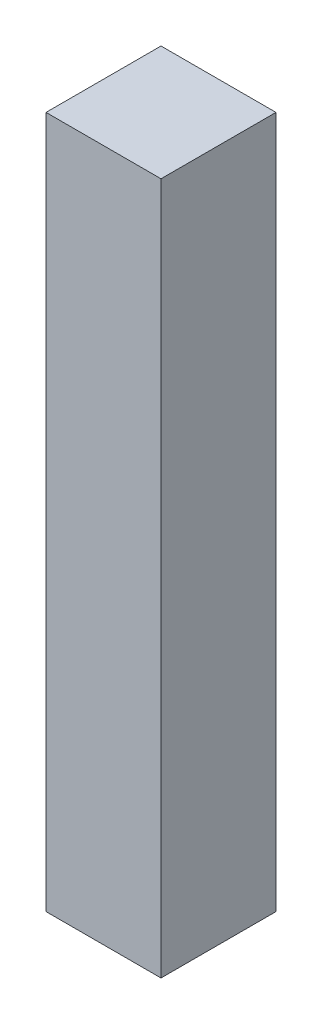
ISO-10303-21;
HEADER;
FILE_DESCRIPTION(('STEP AP214'),'2;1');
FILE_NAME('part.step','',(''),(''),'','','');
FILE_SCHEMA(('AUTOMOTIVE_DESIGN { 1 0 10303 214 1 1 1 1 }'));
ENDSEC;
DATA;
#1=APPLICATION_CONTEXT('core data for automotive mechanical design processes');
#2=APPLICATION_PROTOCOL_DEFINITION('international standard','automotive_design',2000,#1);
#3=PRODUCT_CONTEXT('',#1,'mechanical');
#4=PRODUCT('Part','Part','',(#3));
#5=PRODUCT_RELATED_PRODUCT_CATEGORY('part','',(#4));
#6=PRODUCT_DEFINITION_FORMATION('','',#4);
#7=PRODUCT_DEFINITION_CONTEXT('part definition',#1,'design');
#8=PRODUCT_DEFINITION('design','',#6,#7);
#9=PRODUCT_DEFINITION_SHAPE('','',#8);
#10=(LENGTH_UNIT() NAMED_UNIT(*) SI_UNIT(.MILLI.,.METRE.));
#11=(NAMED_UNIT(*) PLANE_ANGLE_UNIT() SI_UNIT($,.RADIAN.));
#12=(NAMED_UNIT(*) SI_UNIT($,.STERADIAN.) SOLID_ANGLE_UNIT());
#13=UNCERTAINTY_MEASURE_WITH_UNIT(LENGTH_MEASURE(1.E-05),#10,'distance_accuracy_value','');
#14=(GEOMETRIC_REPRESENTATION_CONTEXT(3) GLOBAL_UNCERTAINTY_ASSIGNED_CONTEXT((#13)) GLOBAL_UNIT_ASSIGNED_CONTEXT((#10,
#11,#12)) REPRESENTATION_CONTEXT('',''));
#15=CARTESIAN_POINT('',(0.,0.,0.));
#16=DIRECTION('',(0.,0.,1.));
#17=DIRECTION('',(1.,0.,0.));
#18=AXIS2_PLACEMENT_3D('',#15,#16,#17);
#19=CARTESIAN_POINT('',(10.,120.4,-10.));
#20=DIRECTION('',(-1.,0.,0.));
#21=DIRECTION('',(0.,0.,1.));
#22=AXIS2_PLACEMENT_3D('',#19,#20,#21);
#23=PLANE('',#22);
#24=DIRECTION('',(0.,0.,-1.));
#25=VECTOR('',#24,1.);
#26=CARTESIAN_POINT('',(10.,0.,-10.));
#27=LINE('',#26,#25);
#28=CARTESIAN_POINT('',(10.,0.,10.));
#29=VERTEX_POINT('',#28);
#30=CARTESIAN_POINT('',(10.,0.,-10.));
#31=VERTEX_POINT('',#30);
#32=EDGE_CURVE('E103',#29,#31,#27,.T.);
#33=ORIENTED_EDGE('',*,*,#32,.T.);
#34=DIRECTION('',(0.,-1.,0.));
#35=VECTOR('',#34,1.);
#36=CARTESIAN_POINT('',(10.,120.4,-10.));
#37=LINE('',#36,#35);
#38=CARTESIAN_POINT('',(10.,120.4,-10.));
#39=VERTEX_POINT('',#38);
#40=EDGE_CURVE('E11',#39,#31,#37,.T.);
#41=ORIENTED_EDGE('',*,*,#40,.F.);
#42=DIRECTION('',(0.,0.,-1.));
#43=VECTOR('',#42,1.);
#44=CARTESIAN_POINT('',(10.,120.4,-10.));
#45=LINE('',#44,#43);
#46=CARTESIAN_POINT('',(10.,120.4,10.));
#47=VERTEX_POINT('',#46);
#48=EDGE_CURVE('E91',#47,#39,#45,.T.);
#49=ORIENTED_EDGE('',*,*,#48,.F.);
#50=DIRECTION('',(0.,-1.,0.));
#51=VECTOR('',#50,1.);
#52=CARTESIAN_POINT('',(10.,120.4,10.));
#53=LINE('',#52,#51);
#54=EDGE_CURVE('E99',#47,#29,#53,.T.);
#55=ORIENTED_EDGE('',*,*,#54,.T.);
#56=EDGE_LOOP('',(#33,#41,#49,#55));
#57=FACE_BOUND('',#56,.T.);
#58=ADVANCED_FACE('F40',(#57),#23,.F.);
#59=CARTESIAN_POINT('',(-10.,120.4,-10.));
#60=DIRECTION('',(0.,0.,1.));
#61=DIRECTION('',(1.,0.,0.));
#62=AXIS2_PLACEMENT_3D('',#59,#60,#61);
#63=PLANE('',#62);
#64=DIRECTION('',(-1.,0.,0.));
#65=VECTOR('',#64,1.);
#66=CARTESIAN_POINT('',(-10.,0.,-10.));
#67=LINE('',#66,#65);
#68=CARTESIAN_POINT('',(-10.,0.,-10.));
#69=VERTEX_POINT('',#68);
#70=EDGE_CURVE('E95',#31,#69,#67,.T.);
#71=ORIENTED_EDGE('',*,*,#70,.T.);
#72=DIRECTION('',(0.,-1.,0.));
#73=VECTOR('',#72,1.);
#74=CARTESIAN_POINT('',(-10.,120.4,-10.));
#75=LINE('',#74,#73);
#76=CARTESIAN_POINT('',(-10.,120.4,-10.));
#77=VERTEX_POINT('',#76);
#78=EDGE_CURVE('E48',#77,#69,#75,.T.);
#79=ORIENTED_EDGE('',*,*,#78,.F.);
#80=DIRECTION('',(-1.,0.,0.));
#81=VECTOR('',#80,1.);
#82=CARTESIAN_POINT('',(-10.,120.4,-10.));
#83=LINE('',#82,#81);
#84=EDGE_CURVE('E86',#39,#77,#83,.T.);
#85=ORIENTED_EDGE('',*,*,#84,.F.);
#86=ORIENTED_EDGE('',*,*,#40,.T.);
#87=EDGE_LOOP('',(#71,#79,#85,#86));
#88=FACE_BOUND('',#87,.T.);
#89=ADVANCED_FACE('F94',(#88),#63,.F.);
#90=CARTESIAN_POINT('',(-10.,120.4,-10.));
#91=DIRECTION('',(1.,0.,0.));
#92=DIRECTION('',(0.,0.,-1.));
#93=AXIS2_PLACEMENT_3D('',#90,#91,#92);
#94=PLANE('',#93);
#95=DIRECTION('',(0.,0.,1.));
#96=VECTOR('',#95,1.);
#97=CARTESIAN_POINT('',(-10.,0.,-10.));
#98=LINE('',#97,#96);
#99=CARTESIAN_POINT('',(-10.,0.,10.));
#100=VERTEX_POINT('',#99);
#101=EDGE_CURVE('E73',#69,#100,#98,.T.);
#102=ORIENTED_EDGE('',*,*,#101,.T.);
#103=DIRECTION('',(0.,-1.,0.));
#104=VECTOR('',#103,1.);
#105=CARTESIAN_POINT('',(-10.,120.4,10.));
#106=LINE('',#105,#104);
#107=CARTESIAN_POINT('',(-10.,120.4,10.));
#108=VERTEX_POINT('',#107);
#109=EDGE_CURVE('E96',#108,#100,#106,.T.);
#110=ORIENTED_EDGE('',*,*,#109,.F.);
#111=DIRECTION('',(0.,0.,1.));
#112=VECTOR('',#111,1.);
#113=CARTESIAN_POINT('',(-10.,120.4,-10.));
#114=LINE('',#113,#112);
#115=EDGE_CURVE('E89',#77,#108,#114,.T.);
#116=ORIENTED_EDGE('',*,*,#115,.F.);
#117=ORIENTED_EDGE('',*,*,#78,.T.);
#118=EDGE_LOOP('',(#102,#110,#116,#117));
#119=FACE_BOUND('',#118,.T.);
#120=ADVANCED_FACE('F97',(#119),#94,.F.);
#121=CARTESIAN_POINT('',(-10.,120.4,10.));
#122=DIRECTION('',(0.,0.,-1.));
#123=DIRECTION('',(-1.,0.,0.));
#124=AXIS2_PLACEMENT_3D('',#121,#122,#123);
#125=PLANE('',#124);
#126=DIRECTION('',(1.,0.,0.));
#127=VECTOR('',#126,1.);
#128=CARTESIAN_POINT('',(-10.,0.,10.));
#129=LINE('',#128,#127);
#130=EDGE_CURVE('E79',#100,#29,#129,.T.);
#131=ORIENTED_EDGE('',*,*,#130,.T.);
#132=ORIENTED_EDGE('',*,*,#54,.F.);
#133=DIRECTION('',(1.,0.,0.));
#134=VECTOR('',#133,1.);
#135=CARTESIAN_POINT('',(-10.,120.4,10.));
#136=LINE('',#135,#134);
#137=EDGE_CURVE('E56',#108,#47,#136,.T.);
#138=ORIENTED_EDGE('',*,*,#137,.F.);
#139=ORIENTED_EDGE('',*,*,#109,.T.);
#140=EDGE_LOOP('',(#131,#132,#138,#139));
#141=FACE_BOUND('',#140,.T.);
#142=ADVANCED_FACE('F110',(#141),#125,.F.);
#143=CARTESIAN_POINT('',(0.,120.4,0.));
#144=DIRECTION('',(0.,1.,0.));
#145=DIRECTION('',(0.,0.,1.));
#146=AXIS2_PLACEMENT_3D('',#143,#144,#145);
#147=PLANE('',#146);
#148=ORIENTED_EDGE('',*,*,#48,.T.);
#149=ORIENTED_EDGE('',*,*,#84,.T.);
#150=ORIENTED_EDGE('',*,*,#115,.T.);
#151=ORIENTED_EDGE('',*,*,#137,.T.);
#152=EDGE_LOOP('',(#148,#149,#150,#151));
#153=FACE_BOUND('',#152,.T.);
#154=ADVANCED_FACE('F87',(#153),#147,.T.);
#155=CARTESIAN_POINT('',(0.,0.,0.));
#156=DIRECTION('',(0.,1.,0.));
#157=DIRECTION('',(0.,0.,1.));
#158=AXIS2_PLACEMENT_3D('',#155,#156,#157);
#159=PLANE('',#158);
#160=ORIENTED_EDGE('',*,*,#32,.F.);
#161=ORIENTED_EDGE('',*,*,#130,.F.);
#162=ORIENTED_EDGE('',*,*,#101,.F.);
#163=ORIENTED_EDGE('',*,*,#70,.F.);
#164=EDGE_LOOP('',(#160,#161,#162,#163));
#165=FACE_BOUND('',#164,.T.);
#166=ADVANCED_FACE('F113',(#165),#159,.F.);
#167=CLOSED_SHELL('',(#58,#89,#120,#142,#154,#166));
#168=MANIFOLD_SOLID_BREP('B2',#167);
#169=ADVANCED_BREP_SHAPE_REPRESENTATION('',(#18,#168),#14);
#170=SHAPE_DEFINITION_REPRESENTATION(#9,#169);
ENDSEC;
END-ISO-10303-21;
